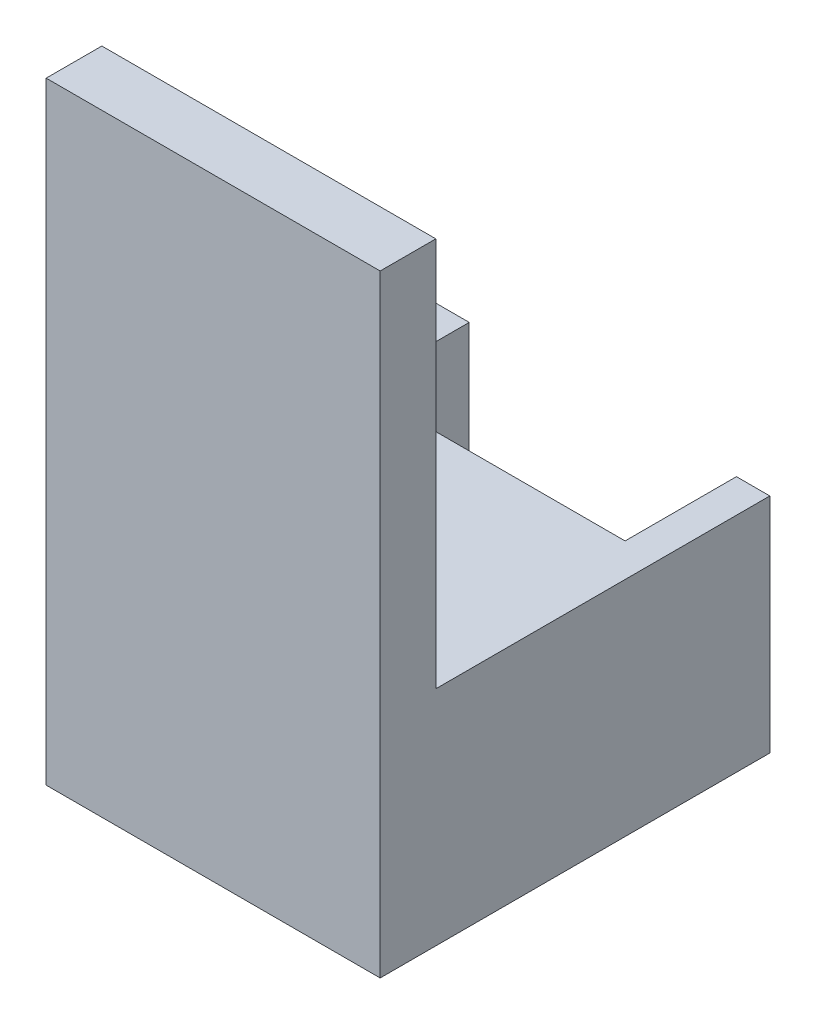
ISO-10303-21;
HEADER;
FILE_DESCRIPTION(('STEP AP214'),'2;1');
FILE_NAME('part.step','',(''),(''),'','','');
FILE_SCHEMA(('AUTOMOTIVE_DESIGN { 1 0 10303 214 1 1 1 1 }'));
ENDSEC;
DATA;
#1=APPLICATION_CONTEXT('core data for automotive mechanical design processes');
#2=APPLICATION_PROTOCOL_DEFINITION('international standard','automotive_design',2000,#1);
#3=PRODUCT_CONTEXT('',#1,'mechanical');
#4=PRODUCT('Part','Part','',(#3));
#5=PRODUCT_RELATED_PRODUCT_CATEGORY('part','',(#4));
#6=PRODUCT_DEFINITION_FORMATION('','',#4);
#7=PRODUCT_DEFINITION_CONTEXT('part definition',#1,'design');
#8=PRODUCT_DEFINITION('design','',#6,#7);
#9=PRODUCT_DEFINITION_SHAPE('','',#8);
#10=(LENGTH_UNIT() NAMED_UNIT(*) SI_UNIT(.MILLI.,.METRE.));
#11=(NAMED_UNIT(*) PLANE_ANGLE_UNIT() SI_UNIT($,.RADIAN.));
#12=(NAMED_UNIT(*) SI_UNIT($,.STERADIAN.) SOLID_ANGLE_UNIT());
#13=UNCERTAINTY_MEASURE_WITH_UNIT(LENGTH_MEASURE(1.E-05),#10,'distance_accuracy_value','');
#14=(GEOMETRIC_REPRESENTATION_CONTEXT(3) GLOBAL_UNCERTAINTY_ASSIGNED_CONTEXT((#13)) GLOBAL_UNIT_ASSIGNED_CONTEXT((#10,
#11,#12)) REPRESENTATION_CONTEXT('',''));
#15=CARTESIAN_POINT('',(0.,0.,0.));
#16=DIRECTION('',(0.,0.,1.));
#17=DIRECTION('',(1.,0.,0.));
#18=AXIS2_PLACEMENT_3D('',#15,#16,#17);
#19=CARTESIAN_POINT('',(0.,20.,0.));
#20=DIRECTION('',(0.,-1.,0.));
#21=DIRECTION('',(0.,0.,-1.));
#22=AXIS2_PLACEMENT_3D('',#19,#20,#21);
#23=PLANE('',#22);
#24=DIRECTION('',(-1.,0.,0.));
#25=VECTOR('',#24,1.);
#26=CARTESIAN_POINT('',(0.,20.,-5.));
#27=LINE('',#26,#25);
#28=CARTESIAN_POINT('',(30.,20.,-5.));
#29=VERTEX_POINT('',#28);
#30=CARTESIAN_POINT('',(0.,20.,-5.));
#31=VERTEX_POINT('',#30);
#32=EDGE_CURVE('E55',#29,#31,#27,.T.);
#33=ORIENTED_EDGE('',*,*,#32,.F.);
#34=DIRECTION('',(0.,0.,-1.));
#35=VECTOR('',#34,1.);
#36=CARTESIAN_POINT('',(30.,20.,0.));
#37=LINE('',#36,#35);
#38=CARTESIAN_POINT('',(30.,20.,-35.));
#39=VERTEX_POINT('',#38);
#40=EDGE_CURVE('E100',#29,#39,#37,.T.);
#41=ORIENTED_EDGE('',*,*,#40,.T.);
#42=DIRECTION('',(-1.,0.,0.));
#43=VECTOR('',#42,1.);
#44=CARTESIAN_POINT('',(27.,20.,-35.));
#45=LINE('',#44,#43);
#46=CARTESIAN_POINT('',(27.,20.,-35.));
#47=VERTEX_POINT('',#46);
#48=EDGE_CURVE('E206',#39,#47,#45,.T.);
#49=ORIENTED_EDGE('',*,*,#48,.T.);
#50=DIRECTION('',(0.,0.,1.));
#51=VECTOR('',#50,1.);
#52=CARTESIAN_POINT('',(27.,20.,-35.));
#53=LINE('',#52,#51);
#54=CARTESIAN_POINT('',(27.,20.,-25.));
#55=VERTEX_POINT('',#54);
#56=EDGE_CURVE('E117',#47,#55,#53,.T.);
#57=ORIENTED_EDGE('',*,*,#56,.T.);
#58=DIRECTION('',(-1.,0.,0.));
#59=VECTOR('',#58,1.);
#60=CARTESIAN_POINT('',(3.,20.,-25.));
#61=LINE('',#60,#59);
#62=CARTESIAN_POINT('',(3.,20.,-25.));
#63=VERTEX_POINT('',#62);
#64=EDGE_CURVE('E111',#55,#63,#61,.T.);
#65=ORIENTED_EDGE('',*,*,#64,.T.);
#66=DIRECTION('',(0.,0.,-1.));
#67=VECTOR('',#66,1.);
#68=CARTESIAN_POINT('',(3.,20.,-35.));
#69=LINE('',#68,#67);
#70=CARTESIAN_POINT('',(3.,20.,-35.));
#71=VERTEX_POINT('',#70);
#72=EDGE_CURVE('E114',#63,#71,#69,.T.);
#73=ORIENTED_EDGE('',*,*,#72,.T.);
#74=DIRECTION('',(-1.,0.,0.));
#75=VECTOR('',#74,1.);
#76=CARTESIAN_POINT('',(0.,20.,-35.));
#77=LINE('',#76,#75);
#78=CARTESIAN_POINT('',(0.,20.,-35.));
#79=VERTEX_POINT('',#78);
#80=EDGE_CURVE('E62',#71,#79,#77,.T.);
#81=ORIENTED_EDGE('',*,*,#80,.T.);
#82=DIRECTION('',(0.,0.,1.));
#83=VECTOR('',#82,1.);
#84=CARTESIAN_POINT('',(0.,20.,0.));
#85=LINE('',#84,#83);
#86=EDGE_CURVE('E166',#79,#31,#85,.T.);
#87=ORIENTED_EDGE('',*,*,#86,.T.);
#88=EDGE_LOOP('',(#33,#41,#49,#57,#65,#73,#81,#87));
#89=FACE_BOUND('',#88,.T.);
#90=ADVANCED_FACE('F39',(#89),#23,.F.);
#91=CARTESIAN_POINT('',(0.,20.,0.));
#92=DIRECTION('',(1.,0.,0.));
#93=DIRECTION('',(0.,0.,-1.));
#94=AXIS2_PLACEMENT_3D('',#91,#92,#93);
#95=PLANE('',#94);
#96=DIRECTION('',(0.,0.,1.));
#97=VECTOR('',#96,1.);
#98=CARTESIAN_POINT('',(0.,0.,0.));
#99=LINE('',#98,#97);
#100=CARTESIAN_POINT('',(0.,0.,-35.));
#101=VERTEX_POINT('',#100);
#102=CARTESIAN_POINT('',(0.,0.,0.));
#103=VERTEX_POINT('',#102);
#104=EDGE_CURVE('E142',#101,#103,#99,.T.);
#105=ORIENTED_EDGE('',*,*,#104,.T.);
#106=DIRECTION('',(0.,-1.,0.));
#107=VECTOR('',#106,1.);
#108=CARTESIAN_POINT('',(0.,20.,0.));
#109=LINE('',#108,#107);
#110=CARTESIAN_POINT('',(0.,55.,0.));
#111=VERTEX_POINT('',#110);
#112=EDGE_CURVE('E11',#111,#103,#109,.T.);
#113=ORIENTED_EDGE('',*,*,#112,.F.);
#114=DIRECTION('',(0.,0.,1.));
#115=VECTOR('',#114,1.);
#116=CARTESIAN_POINT('',(0.,55.,0.));
#117=LINE('',#116,#115);
#118=CARTESIAN_POINT('',(0.,55.,-5.));
#119=VERTEX_POINT('',#118);
#120=EDGE_CURVE('E224',#119,#111,#117,.T.);
#121=ORIENTED_EDGE('',*,*,#120,.F.);
#122=DIRECTION('',(0.,-1.,0.));
#123=VECTOR('',#122,1.);
#124=CARTESIAN_POINT('',(0.,55.,-5.));
#125=LINE('',#124,#123);
#126=EDGE_CURVE('E217',#119,#31,#125,.T.);
#127=ORIENTED_EDGE('',*,*,#126,.T.);
#128=ORIENTED_EDGE('',*,*,#86,.F.);
#129=DIRECTION('',(0.,-1.,0.));
#130=VECTOR('',#129,1.);
#131=CARTESIAN_POINT('',(0.,20.,-35.));
#132=LINE('',#131,#130);
#133=EDGE_CURVE('E138',#79,#101,#132,.T.);
#134=ORIENTED_EDGE('',*,*,#133,.T.);
#135=EDGE_LOOP('',(#105,#113,#121,#127,#128,#134));
#136=FACE_BOUND('',#135,.T.);
#137=ADVANCED_FACE('F41',(#136),#95,.F.);
#138=CARTESIAN_POINT('',(0.,20.,0.));
#139=DIRECTION('',(0.,0.,-1.));
#140=DIRECTION('',(-1.,0.,0.));
#141=AXIS2_PLACEMENT_3D('',#138,#139,#140);
#142=PLANE('',#141);
#143=DIRECTION('',(1.,0.,0.));
#144=VECTOR('',#143,1.);
#145=CARTESIAN_POINT('',(0.,0.,0.));
#146=LINE('',#145,#144);
#147=CARTESIAN_POINT('',(30.,0.,0.));
#148=VERTEX_POINT('',#147);
#149=EDGE_CURVE('E146',#103,#148,#146,.T.);
#150=ORIENTED_EDGE('',*,*,#149,.T.);
#151=DIRECTION('',(0.,-1.,0.));
#152=VECTOR('',#151,1.);
#153=CARTESIAN_POINT('',(30.,20.,0.));
#154=LINE('',#153,#152);
#155=CARTESIAN_POINT('',(30.,55.,0.));
#156=VERTEX_POINT('',#155);
#157=EDGE_CURVE('E48',#156,#148,#154,.T.);
#158=ORIENTED_EDGE('',*,*,#157,.F.);
#159=DIRECTION('',(1.,0.,0.));
#160=VECTOR('',#159,1.);
#161=CARTESIAN_POINT('',(0.,55.,0.));
#162=LINE('',#161,#160);
#163=EDGE_CURVE('E230',#111,#156,#162,.T.);
#164=ORIENTED_EDGE('',*,*,#163,.F.);
#165=ORIENTED_EDGE('',*,*,#112,.T.);
#166=EDGE_LOOP('',(#150,#158,#164,#165));
#167=FACE_BOUND('',#166,.T.);
#168=ADVANCED_FACE('F264',(#167),#142,.F.);
#169=CARTESIAN_POINT('',(30.,20.,0.));
#170=DIRECTION('',(-1.,0.,0.));
#171=DIRECTION('',(0.,0.,1.));
#172=AXIS2_PLACEMENT_3D('',#169,#170,#171);
#173=PLANE('',#172);
#174=DIRECTION('',(0.,0.,-1.));
#175=VECTOR('',#174,1.);
#176=CARTESIAN_POINT('',(30.,0.,0.));
#177=LINE('',#176,#175);
#178=CARTESIAN_POINT('',(30.,0.,-35.));
#179=VERTEX_POINT('',#178);
#180=EDGE_CURVE('E150',#148,#179,#177,.T.);
#181=ORIENTED_EDGE('',*,*,#180,.T.);
#182=DIRECTION('',(0.,-1.,0.));
#183=VECTOR('',#182,1.);
#184=CARTESIAN_POINT('',(30.,20.,-35.));
#185=LINE('',#184,#183);
#186=EDGE_CURVE('E177',#39,#179,#185,.T.);
#187=ORIENTED_EDGE('',*,*,#186,.F.);
#188=ORIENTED_EDGE('',*,*,#40,.F.);
#189=DIRECTION('',(0.,-1.,0.));
#190=VECTOR('',#189,1.);
#191=CARTESIAN_POINT('',(30.,55.,-5.));
#192=LINE('',#191,#190);
#193=CARTESIAN_POINT('',(30.,55.,-5.));
#194=VERTEX_POINT('',#193);
#195=EDGE_CURVE('E147',#194,#29,#192,.T.);
#196=ORIENTED_EDGE('',*,*,#195,.F.);
#197=DIRECTION('',(0.,0.,-1.));
#198=VECTOR('',#197,1.);
#199=CARTESIAN_POINT('',(30.,55.,0.));
#200=LINE('',#199,#198);
#201=EDGE_CURVE('E190',#156,#194,#200,.T.);
#202=ORIENTED_EDGE('',*,*,#201,.F.);
#203=ORIENTED_EDGE('',*,*,#157,.T.);
#204=EDGE_LOOP('',(#181,#187,#188,#196,#202,#203));
#205=FACE_BOUND('',#204,.T.);
#206=ADVANCED_FACE('F186',(#205),#173,.F.);
#207=CARTESIAN_POINT('',(27.,20.,-35.));
#208=DIRECTION('',(0.,0.,1.));
#209=DIRECTION('',(1.,0.,0.));
#210=AXIS2_PLACEMENT_3D('',#207,#208,#209);
#211=PLANE('',#210);
#212=DIRECTION('',(-1.,0.,0.));
#213=VECTOR('',#212,1.);
#214=CARTESIAN_POINT('',(27.,0.,-35.));
#215=LINE('',#214,#213);
#216=CARTESIAN_POINT('',(27.,0.,-35.));
#217=VERTEX_POINT('',#216);
#218=EDGE_CURVE('E153',#179,#217,#215,.T.);
#219=ORIENTED_EDGE('',*,*,#218,.T.);
#220=DIRECTION('',(0.,-1.,0.));
#221=VECTOR('',#220,1.);
#222=CARTESIAN_POINT('',(27.,20.,-35.));
#223=LINE('',#222,#221);
#224=EDGE_CURVE('E173',#47,#217,#223,.T.);
#225=ORIENTED_EDGE('',*,*,#224,.F.);
#226=ORIENTED_EDGE('',*,*,#48,.F.);
#227=ORIENTED_EDGE('',*,*,#186,.T.);
#228=EDGE_LOOP('',(#219,#225,#226,#227));
#229=FACE_BOUND('',#228,.T.);
#230=ADVANCED_FACE('F201',(#229),#211,.F.);
#231=CARTESIAN_POINT('',(27.,20.,-35.));
#232=DIRECTION('',(1.,0.,0.));
#233=DIRECTION('',(0.,0.,-1.));
#234=AXIS2_PLACEMENT_3D('',#231,#232,#233);
#235=PLANE('',#234);
#236=DIRECTION('',(0.,0.,1.));
#237=VECTOR('',#236,1.);
#238=CARTESIAN_POINT('',(27.,0.,-35.));
#239=LINE('',#238,#237);
#240=CARTESIAN_POINT('',(27.,0.,-25.));
#241=VERTEX_POINT('',#240);
#242=EDGE_CURVE('E156',#217,#241,#239,.T.);
#243=ORIENTED_EDGE('',*,*,#242,.T.);
#244=DIRECTION('',(0.,-1.,0.));
#245=VECTOR('',#244,1.);
#246=CARTESIAN_POINT('',(27.,20.,-25.));
#247=LINE('',#246,#245);
#248=EDGE_CURVE('E131',#55,#241,#247,.T.);
#249=ORIENTED_EDGE('',*,*,#248,.F.);
#250=ORIENTED_EDGE('',*,*,#56,.F.);
#251=ORIENTED_EDGE('',*,*,#224,.T.);
#252=EDGE_LOOP('',(#243,#249,#250,#251));
#253=FACE_BOUND('',#252,.T.);
#254=ADVANCED_FACE('F204',(#253),#235,.F.);
#255=CARTESIAN_POINT('',(3.,20.,-25.));
#256=DIRECTION('',(0.,0.,1.));
#257=DIRECTION('',(1.,0.,0.));
#258=AXIS2_PLACEMENT_3D('',#255,#256,#257);
#259=PLANE('',#258);
#260=DIRECTION('',(-1.,0.,0.));
#261=VECTOR('',#260,1.);
#262=CARTESIAN_POINT('',(3.,0.,-25.));
#263=LINE('',#262,#261);
#264=CARTESIAN_POINT('',(3.,0.,-25.));
#265=VERTEX_POINT('',#264);
#266=EDGE_CURVE('E127',#241,#265,#263,.T.);
#267=ORIENTED_EDGE('',*,*,#266,.T.);
#268=DIRECTION('',(0.,-1.,0.));
#269=VECTOR('',#268,1.);
#270=CARTESIAN_POINT('',(3.,20.,-25.));
#271=LINE('',#270,#269);
#272=EDGE_CURVE('E124',#63,#265,#271,.T.);
#273=ORIENTED_EDGE('',*,*,#272,.F.);
#274=ORIENTED_EDGE('',*,*,#64,.F.);
#275=ORIENTED_EDGE('',*,*,#248,.T.);
#276=EDGE_LOOP('',(#267,#273,#274,#275));
#277=FACE_BOUND('',#276,.T.);
#278=ADVANCED_FACE('F125',(#277),#259,.F.);
#279=CARTESIAN_POINT('',(3.,20.,-35.));
#280=DIRECTION('',(-1.,0.,0.));
#281=DIRECTION('',(0.,0.,1.));
#282=AXIS2_PLACEMENT_3D('',#279,#280,#281);
#283=PLANE('',#282);
#284=DIRECTION('',(0.,0.,-1.));
#285=VECTOR('',#284,1.);
#286=CARTESIAN_POINT('',(3.,0.,-35.));
#287=LINE('',#286,#285);
#288=CARTESIAN_POINT('',(3.,0.,-35.));
#289=VERTEX_POINT('',#288);
#290=EDGE_CURVE('E161',#265,#289,#287,.T.);
#291=ORIENTED_EDGE('',*,*,#290,.T.);
#292=DIRECTION('',(0.,-1.,0.));
#293=VECTOR('',#292,1.);
#294=CARTESIAN_POINT('',(3.,20.,-35.));
#295=LINE('',#294,#293);
#296=EDGE_CURVE('E132',#71,#289,#295,.T.);
#297=ORIENTED_EDGE('',*,*,#296,.F.);
#298=ORIENTED_EDGE('',*,*,#72,.F.);
#299=ORIENTED_EDGE('',*,*,#272,.T.);
#300=EDGE_LOOP('',(#291,#297,#298,#299));
#301=FACE_BOUND('',#300,.T.);
#302=ADVANCED_FACE('F134',(#301),#283,.F.);
#303=CARTESIAN_POINT('',(0.,20.,-35.));
#304=DIRECTION('',(0.,0.,1.));
#305=DIRECTION('',(1.,0.,0.));
#306=AXIS2_PLACEMENT_3D('',#303,#304,#305);
#307=PLANE('',#306);
#308=DIRECTION('',(-1.,0.,0.));
#309=VECTOR('',#308,1.);
#310=CARTESIAN_POINT('',(0.,0.,-35.));
#311=LINE('',#310,#309);
#312=EDGE_CURVE('E95',#289,#101,#311,.T.);
#313=ORIENTED_EDGE('',*,*,#312,.T.);
#314=ORIENTED_EDGE('',*,*,#133,.F.);
#315=ORIENTED_EDGE('',*,*,#80,.F.);
#316=ORIENTED_EDGE('',*,*,#296,.T.);
#317=EDGE_LOOP('',(#313,#314,#315,#316));
#318=FACE_BOUND('',#317,.T.);
#319=ADVANCED_FACE('F250',(#318),#307,.F.);
#320=CARTESIAN_POINT('',(0.,0.,0.));
#321=DIRECTION('',(0.,-1.,0.));
#322=DIRECTION('',(0.,0.,-1.));
#323=AXIS2_PLACEMENT_3D('',#320,#321,#322);
#324=PLANE('',#323);
#325=ORIENTED_EDGE('',*,*,#104,.F.);
#326=ORIENTED_EDGE('',*,*,#312,.F.);
#327=ORIENTED_EDGE('',*,*,#290,.F.);
#328=ORIENTED_EDGE('',*,*,#266,.F.);
#329=ORIENTED_EDGE('',*,*,#242,.F.);
#330=ORIENTED_EDGE('',*,*,#218,.F.);
#331=ORIENTED_EDGE('',*,*,#180,.F.);
#332=ORIENTED_EDGE('',*,*,#149,.F.);
#333=EDGE_LOOP('',(#325,#326,#327,#328,#329,#330,#331,#332));
#334=FACE_BOUND('',#333,.T.);
#335=ADVANCED_FACE('F197',(#334),#324,.T.);
#336=CARTESIAN_POINT('',(0.,55.,-5.));
#337=DIRECTION('',(0.,0.,1.));
#338=DIRECTION('',(1.,0.,0.));
#339=AXIS2_PLACEMENT_3D('',#336,#337,#338);
#340=PLANE('',#339);
#341=ORIENTED_EDGE('',*,*,#32,.T.);
#342=ORIENTED_EDGE('',*,*,#126,.F.);
#343=DIRECTION('',(-1.,0.,0.));
#344=VECTOR('',#343,1.);
#345=CARTESIAN_POINT('',(0.,55.,-5.));
#346=LINE('',#345,#344);
#347=EDGE_CURVE('E221',#194,#119,#346,.T.);
#348=ORIENTED_EDGE('',*,*,#347,.F.);
#349=ORIENTED_EDGE('',*,*,#195,.T.);
#350=EDGE_LOOP('',(#341,#342,#348,#349));
#351=FACE_BOUND('',#350,.T.);
#352=ADVANCED_FACE('F249',(#351),#340,.F.);
#353=CARTESIAN_POINT('',(0.,55.,0.));
#354=DIRECTION('',(0.,-1.,0.));
#355=DIRECTION('',(0.,0.,-1.));
#356=AXIS2_PLACEMENT_3D('',#353,#354,#355);
#357=PLANE('',#356);
#358=ORIENTED_EDGE('',*,*,#120,.T.);
#359=ORIENTED_EDGE('',*,*,#163,.T.);
#360=ORIENTED_EDGE('',*,*,#201,.T.);
#361=ORIENTED_EDGE('',*,*,#347,.T.);
#362=EDGE_LOOP('',(#358,#359,#360,#361));
#363=FACE_BOUND('',#362,.T.);
#364=ADVANCED_FACE('F238',(#363),#357,.F.);
#365=CLOSED_SHELL('',(#90,#137,#168,#206,#230,#254,#278,#302,#319,#335,#352,#364));
#366=MANIFOLD_SOLID_BREP('B2',#365);
#367=ADVANCED_BREP_SHAPE_REPRESENTATION('',(#18,#366),#14);
#368=SHAPE_DEFINITION_REPRESENTATION(#9,#367);
ENDSEC;
END-ISO-10303-21;
